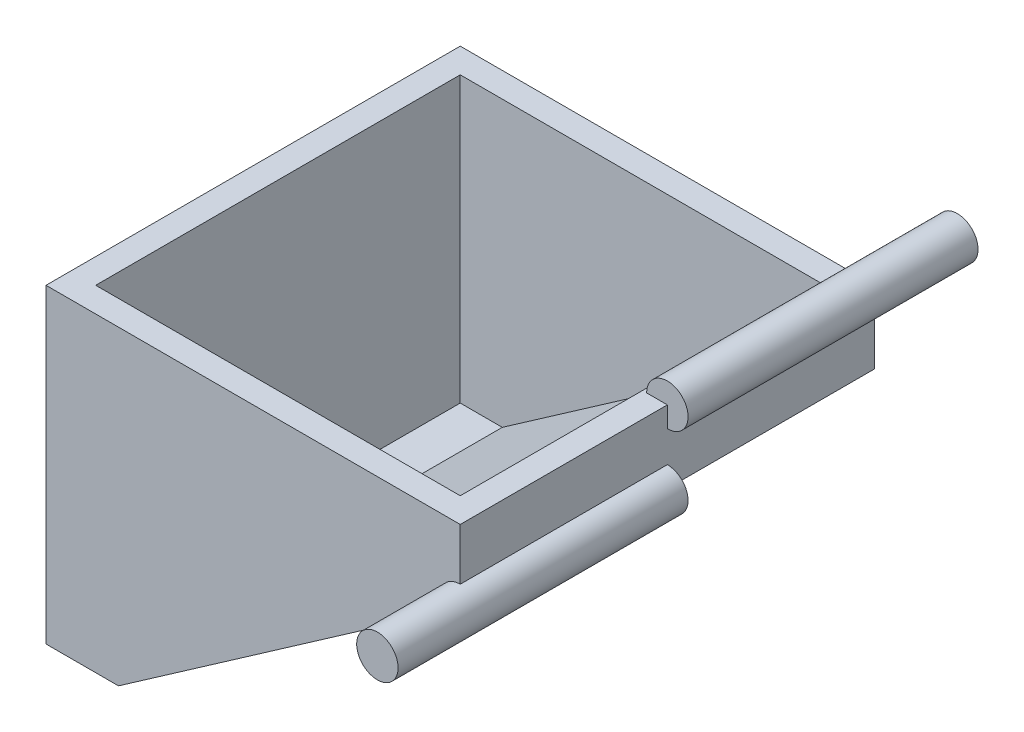
ISO-10303-21;
HEADER;
FILE_DESCRIPTION(('STEP AP214'),'2;1');
FILE_NAME('part.step','',(''),(''),'','','');
FILE_SCHEMA(('AUTOMOTIVE_DESIGN { 1 0 10303 214 1 1 1 1 }'));
ENDSEC;
DATA;
#1=APPLICATION_CONTEXT('core data for automotive mechanical design processes');
#2=APPLICATION_PROTOCOL_DEFINITION('international standard','automotive_design',2000,#1);
#3=PRODUCT_CONTEXT('',#1,'mechanical');
#4=PRODUCT('Part','Part','',(#3));
#5=PRODUCT_RELATED_PRODUCT_CATEGORY('part','',(#4));
#6=PRODUCT_DEFINITION_FORMATION('','',#4);
#7=PRODUCT_DEFINITION_CONTEXT('part definition',#1,'design');
#8=PRODUCT_DEFINITION('design','',#6,#7);
#9=PRODUCT_DEFINITION_SHAPE('','',#8);
#10=(LENGTH_UNIT() NAMED_UNIT(*) SI_UNIT(.MILLI.,.METRE.));
#11=(NAMED_UNIT(*) PLANE_ANGLE_UNIT() SI_UNIT($,.RADIAN.));
#12=(NAMED_UNIT(*) SI_UNIT($,.STERADIAN.) SOLID_ANGLE_UNIT());
#13=UNCERTAINTY_MEASURE_WITH_UNIT(LENGTH_MEASURE(1.E-05),#10,'distance_accuracy_value','');
#14=(GEOMETRIC_REPRESENTATION_CONTEXT(3) GLOBAL_UNCERTAINTY_ASSIGNED_CONTEXT((#13)) GLOBAL_UNIT_ASSIGNED_CONTEXT((#10,
#11,#12)) REPRESENTATION_CONTEXT('',''));
#15=CARTESIAN_POINT('',(0.,0.,0.));
#16=DIRECTION('',(0.,0.,1.));
#17=DIRECTION('',(1.,0.,0.));
#18=AXIS2_PLACEMENT_3D('',#15,#16,#17);
#19=CARTESIAN_POINT('',(1880.,-109.214006033944,120.));
#20=DIRECTION('',(1.,0.,0.));
#21=DIRECTION('',(0.,0.,-1.));
#22=AXIS2_PLACEMENT_3D('',#19,#20,#21);
#23=PLANE('',#22);
#24=DIRECTION('',(0.,1.,0.));
#25=VECTOR('',#24,1.);
#26=CARTESIAN_POINT('',(1880.,-287.365924646409,1880.));
#27=LINE('',#26,#25);
#28=CARTESIAN_POINT('',(1880.,-287.365924646409,1880.));
#29=VERTEX_POINT('',#28);
#30=CARTESIAN_POINT('',(1880.,0.,1880.));
#31=VERTEX_POINT('',#30);
#32=EDGE_CURVE('E179',#29,#31,#27,.T.);
#33=ORIENTED_EDGE('',*,*,#32,.T.);
#34=DIRECTION('',(0.,0.,1.));
#35=VECTOR('',#34,1.);
#36=CARTESIAN_POINT('',(1880.,0.,120.));
#37=LINE('',#36,#35);
#38=CARTESIAN_POINT('',(1880.,0.,120.));
#39=VERTEX_POINT('',#38);
#40=EDGE_CURVE('E196',#39,#31,#37,.T.);
#41=ORIENTED_EDGE('',*,*,#40,.F.);
#42=DIRECTION('',(0.,1.,0.));
#43=VECTOR('',#42,1.);
#44=CARTESIAN_POINT('',(1880.,-287.365924646409,120.));
#45=LINE('',#44,#43);
#46=CARTESIAN_POINT('',(1880.,-287.365924646409,120.));
#47=VERTEX_POINT('',#46);
#48=EDGE_CURVE('E193',#47,#39,#45,.T.);
#49=ORIENTED_EDGE('',*,*,#48,.F.);
#50=DIRECTION('',(0.,0.,1.));
#51=VECTOR('',#50,1.);
#52=CARTESIAN_POINT('',(1880.,-287.365924646409,120.));
#53=LINE('',#52,#51);
#54=EDGE_CURVE('E200',#47,#29,#53,.T.);
#55=ORIENTED_EDGE('',*,*,#54,.T.);
#56=EDGE_LOOP('',(#33,#41,#49,#55));
#57=FACE_BOUND('',#56,.T.);
#58=ADVANCED_FACE('F37',(#57),#23,.F.);
#59=CARTESIAN_POINT('',(323.092909155773,-1372.48298796208,120.));
#60=DIRECTION('',(0.571792661688173,-0.820398166769987,0.));
#61=DIRECTION('',(0.820398166769987,0.571792661688173,0.));
#62=AXIS2_PLACEMENT_3D('',#59,#60,#61);
#63=PLANE('',#62);
#64=DIRECTION('',(0.820398166769987,0.571792661688173,0.));
#65=VECTOR('',#64,1.);
#66=CARTESIAN_POINT('',(323.092909155773,-1372.48298796208,1880.));
#67=LINE('',#66,#65);
#68=CARTESIAN_POINT('',(323.092909155773,-1372.48298796208,1880.));
#69=VERTEX_POINT('',#68);
#70=EDGE_CURVE('E177',#69,#29,#67,.T.);
#71=ORIENTED_EDGE('',*,*,#70,.T.);
#72=ORIENTED_EDGE('',*,*,#54,.F.);
#73=DIRECTION('',(0.820398166769987,0.571792661688173,0.));
#74=VECTOR('',#73,1.);
#75=CARTESIAN_POINT('',(323.092909155773,-1372.48298796208,120.));
#76=LINE('',#75,#74);
#77=CARTESIAN_POINT('',(323.092909155773,-1372.48298796208,120.));
#78=VERTEX_POINT('',#77);
#79=EDGE_CURVE('E190',#78,#47,#76,.T.);
#80=ORIENTED_EDGE('',*,*,#79,.F.);
#81=DIRECTION('',(0.,0.,1.));
#82=VECTOR('',#81,1.);
#83=CARTESIAN_POINT('',(323.092909155773,-1372.48298796208,120.));
#84=LINE('',#83,#82);
#85=EDGE_CURVE('E203',#78,#69,#84,.T.);
#86=ORIENTED_EDGE('',*,*,#85,.T.);
#87=EDGE_LOOP('',(#71,#72,#80,#86));
#88=FACE_BOUND('',#87,.T.);
#89=ADVANCED_FACE('F291',(#88),#63,.F.);
#90=CARTESIAN_POINT('',(120.,-1372.48298796208,120.));
#91=DIRECTION('',(0.,-1.,0.));
#92=DIRECTION('',(0.,0.,-1.));
#93=AXIS2_PLACEMENT_3D('',#90,#91,#92);
#94=PLANE('',#93);
#95=DIRECTION('',(1.,0.,0.));
#96=VECTOR('',#95,1.);
#97=CARTESIAN_POINT('',(120.,-1372.48298796208,1880.));
#98=LINE('',#97,#96);
#99=CARTESIAN_POINT('',(120.,-1372.48298796208,1880.));
#100=VERTEX_POINT('',#99);
#101=EDGE_CURVE('E175',#100,#69,#98,.T.);
#102=ORIENTED_EDGE('',*,*,#101,.T.);
#103=ORIENTED_EDGE('',*,*,#85,.F.);
#104=DIRECTION('',(1.,0.,0.));
#105=VECTOR('',#104,1.);
#106=CARTESIAN_POINT('',(120.,-1372.48298796208,120.));
#107=LINE('',#106,#105);
#108=CARTESIAN_POINT('',(120.,-1372.48298796208,120.));
#109=VERTEX_POINT('',#108);
#110=EDGE_CURVE('E187',#109,#78,#107,.T.);
#111=ORIENTED_EDGE('',*,*,#110,.F.);
#112=DIRECTION('',(0.,0.,1.));
#113=VECTOR('',#112,1.);
#114=CARTESIAN_POINT('',(120.,-1372.48298796208,120.));
#115=LINE('',#114,#113);
#116=EDGE_CURVE('E206',#109,#100,#115,.T.);
#117=ORIENTED_EDGE('',*,*,#116,.T.);
#118=EDGE_LOOP('',(#102,#103,#111,#117));
#119=FACE_BOUND('',#118,.T.);
#120=ADVANCED_FACE('F297',(#119),#94,.F.);
#121=CARTESIAN_POINT('',(120.,0.,120.));
#122=DIRECTION('',(-1.,0.,0.));
#123=DIRECTION('',(0.,-1.,0.));
#124=AXIS2_PLACEMENT_3D('',#121,#122,#123);
#125=PLANE('',#124);
#126=DIRECTION('',(0.,-1.,0.));
#127=VECTOR('',#126,1.);
#128=CARTESIAN_POINT('',(120.,0.,1880.));
#129=LINE('',#128,#127);
#130=CARTESIAN_POINT('',(120.,0.,1880.));
#131=VERTEX_POINT('',#130);
#132=EDGE_CURVE('E173',#131,#100,#129,.T.);
#133=ORIENTED_EDGE('',*,*,#132,.T.);
#134=ORIENTED_EDGE('',*,*,#116,.F.);
#135=DIRECTION('',(0.,-1.,0.));
#136=VECTOR('',#135,1.);
#137=CARTESIAN_POINT('',(120.,0.,120.));
#138=LINE('',#137,#136);
#139=CARTESIAN_POINT('',(120.,0.,120.));
#140=VERTEX_POINT('',#139);
#141=EDGE_CURVE('E184',#140,#109,#138,.T.);
#142=ORIENTED_EDGE('',*,*,#141,.F.);
#143=DIRECTION('',(0.,0.,1.));
#144=VECTOR('',#143,1.);
#145=CARTESIAN_POINT('',(120.,0.,120.));
#146=LINE('',#145,#144);
#147=EDGE_CURVE('E195',#140,#131,#146,.T.);
#148=ORIENTED_EDGE('',*,*,#147,.T.);
#149=EDGE_LOOP('',(#133,#134,#142,#148));
#150=FACE_BOUND('',#149,.T.);
#151=ADVANCED_FACE('F304',(#150),#125,.F.);
#152=CARTESIAN_POINT('',(0.,-1500.,2000.));
#153=DIRECTION('',(1.,0.,0.));
#154=DIRECTION('',(0.,0.,-1.));
#155=AXIS2_PLACEMENT_3D('',#152,#153,#154);
#156=PLANE('',#155);
#157=DIRECTION('',(0.,-1.,0.));
#158=VECTOR('',#157,1.);
#159=CARTESIAN_POINT('',(0.,-1500.,0.));
#160=LINE('',#159,#158);
#161=CARTESIAN_POINT('',(0.,0.,0.));
#162=VERTEX_POINT('',#161);
#163=CARTESIAN_POINT('',(0.,-1500.,0.));
#164=VERTEX_POINT('',#163);
#165=EDGE_CURVE('E199',#162,#164,#160,.T.);
#166=ORIENTED_EDGE('',*,*,#165,.T.);
#167=DIRECTION('',(0.,0.,-1.));
#168=VECTOR('',#167,1.);
#169=CARTESIAN_POINT('',(0.,-1500.,2000.));
#170=LINE('',#169,#168);
#171=CARTESIAN_POINT('',(0.,-1500.,2000.));
#172=VERTEX_POINT('',#171);
#173=EDGE_CURVE('E243',#172,#164,#170,.T.);
#174=ORIENTED_EDGE('',*,*,#173,.F.);
#175=DIRECTION('',(0.,-1.,0.));
#176=VECTOR('',#175,1.);
#177=CARTESIAN_POINT('',(0.,-1500.,2000.));
#178=LINE('',#177,#176);
#179=CARTESIAN_POINT('',(0.,0.,2000.));
#180=VERTEX_POINT('',#179);
#181=EDGE_CURVE('E210',#180,#172,#178,.T.);
#182=ORIENTED_EDGE('',*,*,#181,.F.);
#183=DIRECTION('',(0.,0.,-1.));
#184=VECTOR('',#183,1.);
#185=CARTESIAN_POINT('',(0.,0.,2000.));
#186=LINE('',#185,#184);
#187=EDGE_CURVE('E222',#180,#162,#186,.T.);
#188=ORIENTED_EDGE('',*,*,#187,.T.);
#189=EDGE_LOOP('',(#166,#174,#182,#188));
#190=FACE_BOUND('',#189,.T.);
#191=ADVANCED_FACE('F39',(#190),#156,.F.);
#192=CARTESIAN_POINT('',(350.,-1500.,2000.));
#193=DIRECTION('',(0.,1.,0.));
#194=DIRECTION('',(0.,0.,1.));
#195=AXIS2_PLACEMENT_3D('',#192,#193,#194);
#196=PLANE('',#195);
#197=DIRECTION('',(1.,0.,0.));
#198=VECTOR('',#197,1.);
#199=CARTESIAN_POINT('',(350.,-1500.,0.));
#200=LINE('',#199,#198);
#201=CARTESIAN_POINT('',(350.,-1500.,0.));
#202=VERTEX_POINT('',#201);
#203=EDGE_CURVE('E225',#164,#202,#200,.T.);
#204=ORIENTED_EDGE('',*,*,#203,.T.);
#205=DIRECTION('',(0.,0.,-1.));
#206=VECTOR('',#205,1.);
#207=CARTESIAN_POINT('',(350.,-1500.,2000.));
#208=LINE('',#207,#206);
#209=CARTESIAN_POINT('',(350.,-1500.,2000.));
#210=VERTEX_POINT('',#209);
#211=EDGE_CURVE('E240',#210,#202,#208,.T.);
#212=ORIENTED_EDGE('',*,*,#211,.F.);
#213=DIRECTION('',(1.,0.,0.));
#214=VECTOR('',#213,1.);
#215=CARTESIAN_POINT('',(350.,-1500.,2000.));
#216=LINE('',#215,#214);
#217=EDGE_CURVE('E213',#172,#210,#216,.T.);
#218=ORIENTED_EDGE('',*,*,#217,.F.);
#219=ORIENTED_EDGE('',*,*,#173,.T.);
#220=EDGE_LOOP('',(#204,#212,#218,#219));
#221=FACE_BOUND('',#220,.T.);
#222=ADVANCED_FACE('F276',(#221),#196,.F.);
#223=CARTESIAN_POINT('',(2000.,-350.,2000.));
#224=DIRECTION('',(-0.571792661688173,0.820398166769987,0.));
#225=DIRECTION('',(-0.820398166769987,-0.571792661688173,0.));
#226=AXIS2_PLACEMENT_3D('',#223,#224,#225);
#227=PLANE('',#226);
#228=DIRECTION('',(0.820398166769987,0.571792661688173,0.));
#229=VECTOR('',#228,1.);
#230=CARTESIAN_POINT('',(2000.,-350.,1000.));
#231=LINE('',#230,#229);
#232=CARTESIAN_POINT('',(1917.960183323,-407.179266168817,1000.));
#233=VERTEX_POINT('',#232);
#234=CARTESIAN_POINT('',(2000.,-350.,1000.));
#235=VERTEX_POINT('',#234);
#236=EDGE_CURVE('E142',#233,#235,#231,.T.);
#237=ORIENTED_EDGE('',*,*,#236,.F.);
#238=DIRECTION('',(0.,0.,1.));
#239=VECTOR('',#238,1.);
#240=CARTESIAN_POINT('',(1917.960183323,-407.179266168817,1000.));
#241=LINE('',#240,#239);
#242=CARTESIAN_POINT('',(1917.960183323,-407.179266168817,2000.));
#243=VERTEX_POINT('',#242);
#244=EDGE_CURVE('E146',#233,#243,#241,.T.);
#245=ORIENTED_EDGE('',*,*,#244,.T.);
#246=DIRECTION('',(0.820398166769987,0.571792661688173,0.));
#247=VECTOR('',#246,1.);
#248=CARTESIAN_POINT('',(2000.,-350.,2000.));
#249=LINE('',#248,#247);
#250=EDGE_CURVE('E216',#210,#243,#249,.T.);
#251=ORIENTED_EDGE('',*,*,#250,.F.);
#252=ORIENTED_EDGE('',*,*,#211,.T.);
#253=DIRECTION('',(0.820398166769987,0.571792661688173,0.));
#254=VECTOR('',#253,1.);
#255=CARTESIAN_POINT('',(2000.,-350.,0.));
#256=LINE('',#255,#254);
#257=CARTESIAN_POINT('',(2000.,-350.,0.));
#258=VERTEX_POINT('',#257);
#259=EDGE_CURVE('E227',#202,#258,#256,.T.);
#260=ORIENTED_EDGE('',*,*,#259,.T.);
#261=DIRECTION('',(0.,0.,-1.));
#262=VECTOR('',#261,1.);
#263=CARTESIAN_POINT('',(2000.,-350.,2000.));
#264=LINE('',#263,#262);
#265=EDGE_CURVE('E238',#235,#258,#264,.T.);
#266=ORIENTED_EDGE('',*,*,#265,.F.);
#267=EDGE_LOOP('',(#237,#245,#251,#252,#260,#266));
#268=FACE_BOUND('',#267,.T.);
#269=ADVANCED_FACE('F255',(#268),#227,.F.);
#270=CARTESIAN_POINT('',(2000.,0.,2000.));
#271=DIRECTION('',(-1.,0.,0.));
#272=DIRECTION('',(0.,0.,1.));
#273=AXIS2_PLACEMENT_3D('',#270,#271,#272);
#274=PLANE('',#273);
#275=DIRECTION('',(0.,1.,0.));
#276=VECTOR('',#275,1.);
#277=CARTESIAN_POINT('',(2000.,0.,2000.));
#278=LINE('',#277,#276);
#279=CARTESIAN_POINT('',(2000.,-250.,2000.));
#280=VERTEX_POINT('',#279);
#281=CARTESIAN_POINT('',(2000.,0.,2000.));
#282=VERTEX_POINT('',#281);
#283=EDGE_CURVE('E152',#280,#282,#278,.T.);
#284=ORIENTED_EDGE('',*,*,#283,.F.);
#285=DIRECTION('',(0.,0.,1.));
#286=VECTOR('',#285,1.);
#287=CARTESIAN_POINT('',(2000.,-250.,1000.));
#288=LINE('',#287,#286);
#289=CARTESIAN_POINT('',(2000.,-250.,1000.));
#290=VERTEX_POINT('',#289);
#291=EDGE_CURVE('E52',#280,#290,#288,.F.);
#292=ORIENTED_EDGE('',*,*,#291,.T.);
#293=DIRECTION('',(0.,1.,0.));
#294=VECTOR('',#293,1.);
#295=CARTESIAN_POINT('',(2000.,0.,1000.));
#296=LINE('',#295,#294);
#297=EDGE_CURVE('E11',#235,#290,#296,.T.);
#298=ORIENTED_EDGE('',*,*,#297,.F.);
#299=ORIENTED_EDGE('',*,*,#265,.T.);
#300=DIRECTION('',(0.,1.,0.));
#301=VECTOR('',#300,1.);
#302=CARTESIAN_POINT('',(2000.,0.,0.));
#303=LINE('',#302,#301);
#304=CARTESIAN_POINT('',(2000.,-100.,0.));
#305=VERTEX_POINT('',#304);
#306=EDGE_CURVE('E230',#258,#305,#303,.T.);
#307=ORIENTED_EDGE('',*,*,#306,.T.);
#308=DIRECTION('',(0.,0.,-1.));
#309=VECTOR('',#308,1.);
#310=CARTESIAN_POINT('',(2000.,-100.,1000.));
#311=LINE('',#310,#309);
#312=CARTESIAN_POINT('',(2000.,-100.,1000.));
#313=VERTEX_POINT('',#312);
#314=EDGE_CURVE('E60',#305,#313,#311,.F.);
#315=ORIENTED_EDGE('',*,*,#314,.T.);
#316=DIRECTION('',(0.,-1.,0.));
#317=VECTOR('',#316,1.);
#318=CARTESIAN_POINT('',(2000.,0.,1000.));
#319=LINE('',#318,#317);
#320=CARTESIAN_POINT('',(2000.,0.,1000.));
#321=VERTEX_POINT('',#320);
#322=EDGE_CURVE('E168',#321,#313,#319,.T.);
#323=ORIENTED_EDGE('',*,*,#322,.F.);
#324=DIRECTION('',(0.,0.,-1.));
#325=VECTOR('',#324,1.);
#326=CARTESIAN_POINT('',(2000.,0.,2000.));
#327=LINE('',#326,#325);
#328=EDGE_CURVE('E235',#282,#321,#327,.T.);
#329=ORIENTED_EDGE('',*,*,#328,.F.);
#330=EDGE_LOOP('',(#284,#292,#298,#299,#307,#315,#323,#329));
#331=FACE_BOUND('',#330,.T.);
#332=ADVANCED_FACE('F150',(#331),#274,.F.);
#333=CARTESIAN_POINT('',(0.,0.,2000.));
#334=DIRECTION('',(0.,-1.,0.));
#335=DIRECTION('',(0.,0.,-1.));
#336=AXIS2_PLACEMENT_3D('',#333,#334,#335);
#337=PLANE('',#336);
#338=DIRECTION('',(1.,0.,0.));
#339=VECTOR('',#338,1.);
#340=CARTESIAN_POINT('',(0.,0.,1000.));
#341=LINE('',#340,#339);
#342=CARTESIAN_POINT('',(1900.,0.,1000.));
#343=VERTEX_POINT('',#342);
#344=EDGE_CURVE('E249',#343,#321,#341,.T.);
#345=ORIENTED_EDGE('',*,*,#344,.F.);
#346=DIRECTION('',(0.,0.,-1.));
#347=VECTOR('',#346,1.);
#348=CARTESIAN_POINT('',(1900.,0.,1000.));
#349=LINE('',#348,#347);
#350=CARTESIAN_POINT('',(1900.,0.,0.));
#351=VERTEX_POINT('',#350);
#352=EDGE_CURVE('E164',#343,#351,#349,.T.);
#353=ORIENTED_EDGE('',*,*,#352,.T.);
#354=DIRECTION('',(-1.,0.,0.));
#355=VECTOR('',#354,1.);
#356=CARTESIAN_POINT('',(0.,0.,0.));
#357=LINE('',#356,#355);
#358=EDGE_CURVE('E214',#351,#162,#357,.T.);
#359=ORIENTED_EDGE('',*,*,#358,.T.);
#360=ORIENTED_EDGE('',*,*,#187,.F.);
#361=DIRECTION('',(-1.,0.,0.));
#362=VECTOR('',#361,1.);
#363=CARTESIAN_POINT('',(0.,0.,2000.));
#364=LINE('',#363,#362);
#365=EDGE_CURVE('E220',#282,#180,#364,.T.);
#366=ORIENTED_EDGE('',*,*,#365,.F.);
#367=ORIENTED_EDGE('',*,*,#328,.T.);
#368=EDGE_LOOP('',(#345,#353,#359,#360,#366,#367));
#369=FACE_BOUND('',#368,.T.);
#370=DIRECTION('',(-1.,0.,0.));
#371=VECTOR('',#370,1.);
#372=CARTESIAN_POINT('',(1880.,0.,120.));
#373=LINE('',#372,#371);
#374=EDGE_CURVE('E181',#39,#140,#373,.T.);
#375=ORIENTED_EDGE('',*,*,#374,.F.);
#376=ORIENTED_EDGE('',*,*,#40,.T.);
#377=DIRECTION('',(-1.,0.,0.));
#378=VECTOR('',#377,1.);
#379=CARTESIAN_POINT('',(1880.,0.,1880.));
#380=LINE('',#379,#378);
#381=EDGE_CURVE('E170',#31,#131,#380,.T.);
#382=ORIENTED_EDGE('',*,*,#381,.T.);
#383=ORIENTED_EDGE('',*,*,#147,.F.);
#384=EDGE_LOOP('',(#375,#376,#382,#383));
#385=FACE_BOUND('',#384,.T.);
#386=ADVANCED_FACE('F267',(#369,#385),#337,.F.);
#387=CARTESIAN_POINT('',(0.,0.,2000.));
#388=DIRECTION('',(0.,0.,-1.));
#389=DIRECTION('',(-1.,0.,0.));
#390=AXIS2_PLACEMENT_3D('',#387,#388,#389);
#391=PLANE('',#390);
#392=ORIENTED_EDGE('',*,*,#250,.T.);
#393=CARTESIAN_POINT('',(2000.,-350.,2000.));
#394=DIRECTION('',(0.,0.,-1.));
#395=DIRECTION('',(-1.,0.,0.));
#396=AXIS2_PLACEMENT_3D('',#393,#394,#395);
#397=CIRCLE('',#396,100.);
#398=EDGE_CURVE('E45',#243,#280,#397,.T.);
#399=ORIENTED_EDGE('',*,*,#398,.T.);
#400=ORIENTED_EDGE('',*,*,#283,.T.);
#401=ORIENTED_EDGE('',*,*,#365,.T.);
#402=ORIENTED_EDGE('',*,*,#181,.T.);
#403=ORIENTED_EDGE('',*,*,#217,.T.);
#404=EDGE_LOOP('',(#392,#399,#400,#401,#402,#403));
#405=FACE_BOUND('',#404,.T.);
#406=ADVANCED_FACE('F252',(#405),#391,.F.);
#407=CARTESIAN_POINT('',(0.,0.,0.));
#408=DIRECTION('',(0.,0.,-1.));
#409=DIRECTION('',(-1.,0.,0.));
#410=AXIS2_PLACEMENT_3D('',#407,#408,#409);
#411=PLANE('',#410);
#412=CARTESIAN_POINT('',(2000.,0.,0.));
#413=DIRECTION('',(0.,0.,-1.));
#414=DIRECTION('',(-1.,0.,0.));
#415=AXIS2_PLACEMENT_3D('',#412,#413,#414);
#416=CIRCLE('',#415,100.);
#417=EDGE_CURVE('E246',#305,#351,#416,.T.);
#418=ORIENTED_EDGE('',*,*,#417,.F.);
#419=ORIENTED_EDGE('',*,*,#306,.F.);
#420=ORIENTED_EDGE('',*,*,#259,.F.);
#421=ORIENTED_EDGE('',*,*,#203,.F.);
#422=ORIENTED_EDGE('',*,*,#165,.F.);
#423=ORIENTED_EDGE('',*,*,#358,.F.);
#424=EDGE_LOOP('',(#418,#419,#420,#421,#422,#423));
#425=FACE_BOUND('',#424,.T.);
#426=ADVANCED_FACE('F277',(#425),#411,.T.);
#427=CARTESIAN_POINT('',(0.,0.,120.));
#428=DIRECTION('',(0.,0.,1.));
#429=DIRECTION('',(1.,0.,0.));
#430=AXIS2_PLACEMENT_3D('',#427,#428,#429);
#431=PLANE('',#430);
#432=ORIENTED_EDGE('',*,*,#374,.T.);
#433=ORIENTED_EDGE('',*,*,#141,.T.);
#434=ORIENTED_EDGE('',*,*,#110,.T.);
#435=ORIENTED_EDGE('',*,*,#79,.T.);
#436=ORIENTED_EDGE('',*,*,#48,.T.);
#437=EDGE_LOOP('',(#432,#433,#434,#435,#436));
#438=FACE_BOUND('',#437,.T.);
#439=ADVANCED_FACE('F279',(#438),#431,.T.);
#440=CARTESIAN_POINT('',(0.,0.,1880.));
#441=DIRECTION('',(0.,0.,1.));
#442=DIRECTION('',(1.,0.,0.));
#443=AXIS2_PLACEMENT_3D('',#440,#441,#442);
#444=PLANE('',#443);
#445=ORIENTED_EDGE('',*,*,#381,.F.);
#446=ORIENTED_EDGE('',*,*,#32,.F.);
#447=ORIENTED_EDGE('',*,*,#70,.F.);
#448=ORIENTED_EDGE('',*,*,#101,.F.);
#449=ORIENTED_EDGE('',*,*,#132,.F.);
#450=EDGE_LOOP('',(#445,#446,#447,#448,#449));
#451=FACE_BOUND('',#450,.T.);
#452=ADVANCED_FACE('F285',(#451),#444,.F.);
#453=CARTESIAN_POINT('',(2000.,0.,1000.));
#454=DIRECTION('',(0.,0.,-1.));
#455=DIRECTION('',(-1.,0.,0.));
#456=AXIS2_PLACEMENT_3D('',#453,#454,#455);
#457=PLANE('',#456);
#458=ORIENTED_EDGE('',*,*,#344,.T.);
#459=ORIENTED_EDGE('',*,*,#322,.T.);
#460=CARTESIAN_POINT('',(2000.,0.,1000.));
#461=DIRECTION('',(0.,0.,-1.));
#462=DIRECTION('',(-1.,0.,0.));
#463=AXIS2_PLACEMENT_3D('',#460,#461,#462);
#464=CIRCLE('',#463,100.);
#465=EDGE_CURVE('E161',#343,#313,#464,.T.);
#466=ORIENTED_EDGE('',*,*,#465,.F.);
#467=EDGE_LOOP('',(#458,#459,#466));
#468=FACE_BOUND('',#467,.T.);
#469=ADVANCED_FACE('F264',(#468),#457,.F.);
#470=CARTESIAN_POINT('',(2000.,0.,1000.));
#471=DIRECTION('',(0.,0.,-1.));
#472=DIRECTION('',(-1.,0.,0.));
#473=AXIS2_PLACEMENT_3D('',#470,#471,#472);
#474=CYLINDRICAL_SURFACE('',#473,100.);
#475=CARTESIAN_POINT('',(2000.,0.,-400.));
#476=DIRECTION('',(0.,0.,-1.));
#477=DIRECTION('',(-1.,0.,0.));
#478=AXIS2_PLACEMENT_3D('',#475,#476,#477);
#479=CIRCLE('',#478,100.);
#480=CARTESIAN_POINT('',(1900.,0.,-400.));
#481=VERTEX_POINT('',#480);
#482=EDGE_CURVE('E158',#481,#481,#479,.T.);
#483=ORIENTED_EDGE('',*,*,#482,.F.);
#484=EDGE_LOOP('',(#483));
#485=FACE_BOUND('',#484,.T.);
#486=ORIENTED_EDGE('',*,*,#314,.F.);
#487=ORIENTED_EDGE('',*,*,#417,.T.);
#488=ORIENTED_EDGE('',*,*,#352,.F.);
#489=ORIENTED_EDGE('',*,*,#465,.T.);
#490=EDGE_LOOP('',(#486,#487,#488,#489));
#491=FACE_BOUND('',#490,.T.);
#492=ADVANCED_FACE('F260',(#485,#491),#474,.T.);
#493=CARTESIAN_POINT('',(2000.,0.,-400.));
#494=DIRECTION('',(0.,0.,-1.));
#495=DIRECTION('',(-1.,0.,0.));
#496=AXIS2_PLACEMENT_3D('',#493,#494,#495);
#497=PLANE('',#496);
#498=ORIENTED_EDGE('',*,*,#482,.T.);
#499=EDGE_LOOP('',(#498));
#500=FACE_BOUND('',#499,.T.);
#501=ADVANCED_FACE('F365',(#500),#497,.T.);
#502=CARTESIAN_POINT('',(2000.,-350.,1000.));
#503=DIRECTION('',(0.,0.,1.));
#504=DIRECTION('',(1.,0.,0.));
#505=AXIS2_PLACEMENT_3D('',#502,#503,#504);
#506=PLANE('',#505);
#507=CARTESIAN_POINT('',(2000.,-350.,1000.));
#508=DIRECTION('',(0.,0.,1.));
#509=DIRECTION('',(1.,0.,0.));
#510=AXIS2_PLACEMENT_3D('',#507,#508,#509);
#511=CIRCLE('',#510,100.);
#512=EDGE_CURVE('E140',#233,#290,#511,.T.);
#513=ORIENTED_EDGE('',*,*,#512,.F.);
#514=ORIENTED_EDGE('',*,*,#236,.T.);
#515=ORIENTED_EDGE('',*,*,#297,.T.);
#516=EDGE_LOOP('',(#513,#514,#515));
#517=FACE_BOUND('',#516,.T.);
#518=ADVANCED_FACE('F139',(#517),#506,.F.);
#519=CARTESIAN_POINT('',(2000.,-350.,1000.));
#520=DIRECTION('',(0.,0.,1.));
#521=DIRECTION('',(1.,0.,0.));
#522=AXIS2_PLACEMENT_3D('',#519,#520,#521);
#523=CYLINDRICAL_SURFACE('',#522,100.);
#524=CARTESIAN_POINT('',(2000.,-350.,2400.));
#525=DIRECTION('',(0.,0.,1.));
#526=DIRECTION('',(1.,0.,0.));
#527=AXIS2_PLACEMENT_3D('',#524,#525,#526);
#528=CIRCLE('',#527,100.);
#529=CARTESIAN_POINT('',(2100.,-350.,2400.));
#530=VERTEX_POINT('',#529);
#531=EDGE_CURVE('E147',#530,#530,#528,.T.);
#532=ORIENTED_EDGE('',*,*,#531,.F.);
#533=EDGE_LOOP('',(#532));
#534=FACE_BOUND('',#533,.T.);
#535=ORIENTED_EDGE('',*,*,#244,.F.);
#536=ORIENTED_EDGE('',*,*,#512,.T.);
#537=ORIENTED_EDGE('',*,*,#291,.F.);
#538=ORIENTED_EDGE('',*,*,#398,.F.);
#539=EDGE_LOOP('',(#535,#536,#537,#538));
#540=FACE_BOUND('',#539,.T.);
#541=ADVANCED_FACE('F144',(#534,#540),#523,.T.);
#542=CARTESIAN_POINT('',(2000.,-350.,2400.));
#543=DIRECTION('',(0.,0.,1.));
#544=DIRECTION('',(1.,0.,0.));
#545=AXIS2_PLACEMENT_3D('',#542,#543,#544);
#546=PLANE('',#545);
#547=ORIENTED_EDGE('',*,*,#531,.T.);
#548=EDGE_LOOP('',(#547));
#549=FACE_BOUND('',#548,.T.);
#550=ADVANCED_FACE('F377',(#549),#546,.T.);
#551=CLOSED_SHELL('',(#58,#89,#120,#151,#191,#222,#269,#332,#386,#406,#426,#439,#452,#469,#492,
#501,#518,#541,#550));
#552=MANIFOLD_SOLID_BREP('B2',#551);
#553=ADVANCED_BREP_SHAPE_REPRESENTATION('',(#18,#552),#14);
#554=SHAPE_DEFINITION_REPRESENTATION(#9,#553);
ENDSEC;
END-ISO-10303-21;
